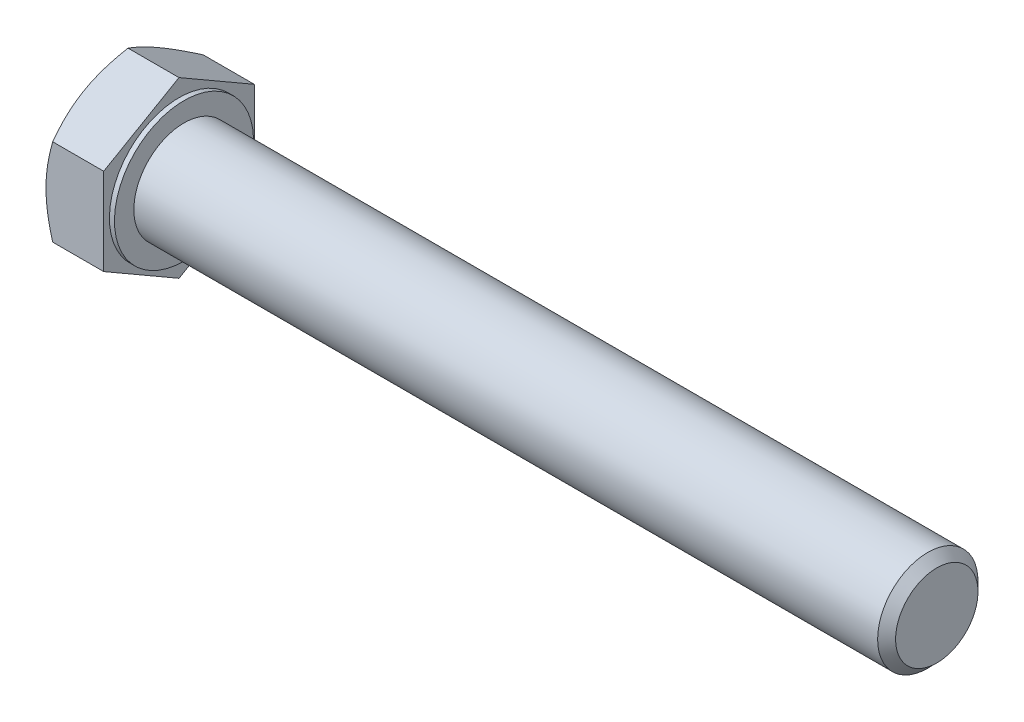
ISO-10303-21;
HEADER;
FILE_DESCRIPTION(('STEP AP214'),'2;1');
FILE_NAME('part.step','',(''),(''),'','','');
FILE_SCHEMA(('AUTOMOTIVE_DESIGN { 1 0 10303 214 1 1 1 1 }'));
ENDSEC;
DATA;
#1=APPLICATION_CONTEXT('core data for automotive mechanical design processes');
#2=APPLICATION_PROTOCOL_DEFINITION('international standard','automotive_design',2000,#1);
#3=PRODUCT_CONTEXT('',#1,'mechanical');
#4=PRODUCT('Part','Part','',(#3));
#5=PRODUCT_RELATED_PRODUCT_CATEGORY('part','',(#4));
#6=PRODUCT_DEFINITION_FORMATION('','',#4);
#7=PRODUCT_DEFINITION_CONTEXT('part definition',#1,'design');
#8=PRODUCT_DEFINITION('design','',#6,#7);
#9=PRODUCT_DEFINITION_SHAPE('','',#8);
#10=(LENGTH_UNIT() NAMED_UNIT(*) SI_UNIT(.MILLI.,.METRE.));
#11=(NAMED_UNIT(*) PLANE_ANGLE_UNIT() SI_UNIT($,.RADIAN.));
#12=(NAMED_UNIT(*) SI_UNIT($,.STERADIAN.) SOLID_ANGLE_UNIT());
#13=UNCERTAINTY_MEASURE_WITH_UNIT(LENGTH_MEASURE(1.E-05),#10,'distance_accuracy_value','');
#14=(GEOMETRIC_REPRESENTATION_CONTEXT(3) GLOBAL_UNCERTAINTY_ASSIGNED_CONTEXT((#13)) GLOBAL_UNIT_ASSIGNED_CONTEXT((#10,
#11,#12)) REPRESENTATION_CONTEXT('',''));
#15=CARTESIAN_POINT('',(0.,0.,0.));
#16=DIRECTION('',(0.,0.,1.));
#17=DIRECTION('',(1.,0.,0.));
#18=AXIS2_PLACEMENT_3D('',#15,#16,#17);
#19=CARTESIAN_POINT('',(0.,7.1575,0.));
#20=DIRECTION('',(1.,0.,0.));
#21=DIRECTION('',(0.,1.,0.));
#22=AXIS2_PLACEMENT_3D('',#19,#20,#21);
#23=PLANE('',#22);
#24=CARTESIAN_POINT('',(0.,0.,0.));
#25=DIRECTION('',(1.,0.,0.));
#26=DIRECTION('',(0.,1.,0.));
#27=AXIS2_PLACEMENT_3D('',#24,#25,#26);
#28=CIRCLE('',#27,6.);
#29=CARTESIAN_POINT('',(0.,-6.,0.));
#30=VERTEX_POINT('',#29);
#31=EDGE_CURVE('E245',#30,#30,#28,.T.);
#32=ORIENTED_EDGE('',*,*,#31,.F.);
#33=EDGE_LOOP('',(#32));
#34=FACE_BOUND('',#33,.T.);
#35=CARTESIAN_POINT('',(0.,0.,0.));
#36=DIRECTION('',(1.,0.,0.));
#37=DIRECTION('',(0.,1.,0.));
#38=AXIS2_PLACEMENT_3D('',#35,#36,#37);
#39=CIRCLE('',#38,8.315);
#40=CARTESIAN_POINT('',(0.,-8.315,0.));
#41=VERTEX_POINT('',#40);
#42=EDGE_CURVE('E28',#41,#41,#39,.T.);
#43=ORIENTED_EDGE('',*,*,#42,.T.);
#44=EDGE_LOOP('',(#43));
#45=FACE_BOUND('',#44,.T.);
#46=ADVANCED_FACE('F17',(#34,#45),#23,.T.);
#47=CARTESIAN_POINT('',(-0.300049999999992,0.,0.));
#48=DIRECTION('',(1.,0.,0.));
#49=DIRECTION('',(0.,1.,0.));
#50=AXIS2_PLACEMENT_3D('',#47,#48,#49);
#51=CYLINDRICAL_SURFACE('',#50,8.315);
#52=ORIENTED_EDGE('',*,*,#42,.F.);
#53=DIRECTION('',(-1.,0.,0.));
#54=VECTOR('',#53,1.);
#55=CARTESIAN_POINT('',(-0.300049999999992,-8.315,0.));
#56=LINE('',#55,#54);
#57=CARTESIAN_POINT('',(-0.6001,-8.315,0.));
#58=VERTEX_POINT('',#57);
#59=EDGE_CURVE('E11',#41,#58,#56,.T.);
#60=ORIENTED_EDGE('',*,*,#59,.T.);
#61=CARTESIAN_POINT('',(-0.6001,0.,0.));
#62=DIRECTION('',(1.,0.,0.));
#63=DIRECTION('',(0.,1.,0.));
#64=AXIS2_PLACEMENT_3D('',#61,#62,#63);
#65=CIRCLE('',#64,8.315);
#66=EDGE_CURVE('E205',#58,#58,#65,.T.);
#67=ORIENTED_EDGE('',*,*,#66,.T.);
#68=ORIENTED_EDGE('',*,*,#59,.F.);
#69=EDGE_LOOP('',(#52,#60,#67,#68));
#70=FACE_BOUND('',#69,.T.);
#71=ADVANCED_FACE('F375',(#70),#51,.T.);
#72=CARTESIAN_POINT('',(-7.5001,0.,0.));
#73=DIRECTION('',(1.,0.,0.));
#74=DIRECTION('',(0.,1.,0.));
#75=AXIS2_PLACEMENT_3D('',#72,#73,#74);
#76=PLANE('',#75);
#77=CARTESIAN_POINT('',(-7.5001,0.,0.));
#78=DIRECTION('',(-1.,0.,0.));
#79=DIRECTION('',(0.,1.,0.));
#80=AXIS2_PLACEMENT_3D('',#77,#78,#79);
#81=CIRCLE('',#80,9.);
#82=CARTESIAN_POINT('',(-7.5001,0.,9.));
#83=VERTEX_POINT('',#82);
#84=CARTESIAN_POINT('',(-7.5001,7.79422863405994,4.5));
#85=VERTEX_POINT('',#84);
#86=EDGE_CURVE('E234',#83,#85,#81,.T.);
#87=ORIENTED_EDGE('',*,*,#86,.T.);
#88=CARTESIAN_POINT('',(-7.5001,0.,0.));
#89=DIRECTION('',(-1.,0.,0.));
#90=DIRECTION('',(0.,1.,0.));
#91=AXIS2_PLACEMENT_3D('',#88,#89,#90);
#92=CIRCLE('',#91,9.);
#93=CARTESIAN_POINT('',(-7.5001,7.79422863405994,-4.5));
#94=VERTEX_POINT('',#93);
#95=EDGE_CURVE('E166',#85,#94,#92,.T.);
#96=ORIENTED_EDGE('',*,*,#95,.T.);
#97=CARTESIAN_POINT('',(-7.5001,0.,0.));
#98=DIRECTION('',(-1.,0.,0.));
#99=DIRECTION('',(0.,1.,0.));
#100=AXIS2_PLACEMENT_3D('',#97,#98,#99);
#101=CIRCLE('',#100,9.);
#102=CARTESIAN_POINT('',(-7.5001,0.,-9.));
#103=VERTEX_POINT('',#102);
#104=EDGE_CURVE('E189',#94,#103,#101,.T.);
#105=ORIENTED_EDGE('',*,*,#104,.T.);
#106=CARTESIAN_POINT('',(-7.5001,0.,0.));
#107=DIRECTION('',(-1.,0.,0.));
#108=DIRECTION('',(0.,1.,0.));
#109=AXIS2_PLACEMENT_3D('',#106,#107,#108);
#110=CIRCLE('',#109,9.);
#111=CARTESIAN_POINT('',(-7.5001,-7.79422863405994,-4.5));
#112=VERTEX_POINT('',#111);
#113=EDGE_CURVE('E21',#103,#112,#110,.T.);
#114=ORIENTED_EDGE('',*,*,#113,.T.);
#115=CARTESIAN_POINT('',(-7.5001,0.,0.));
#116=DIRECTION('',(-1.,0.,0.));
#117=DIRECTION('',(0.,1.,0.));
#118=AXIS2_PLACEMENT_3D('',#115,#116,#117);
#119=CIRCLE('',#118,9.);
#120=CARTESIAN_POINT('',(-7.5001,-7.79422863405995,4.5));
#121=VERTEX_POINT('',#120);
#122=EDGE_CURVE('E156',#112,#121,#119,.T.);
#123=ORIENTED_EDGE('',*,*,#122,.T.);
#124=CARTESIAN_POINT('',(-7.5001,0.,0.));
#125=DIRECTION('',(-1.,0.,0.));
#126=DIRECTION('',(0.,1.,0.));
#127=AXIS2_PLACEMENT_3D('',#124,#125,#126);
#128=CIRCLE('',#127,9.);
#129=EDGE_CURVE('E214',#121,#83,#128,.T.);
#130=ORIENTED_EDGE('',*,*,#129,.T.);
#131=EDGE_LOOP('',(#87,#96,#105,#114,#123,#130));
#132=FACE_BOUND('',#131,.T.);
#133=ADVANCED_FACE('F338',(#132),#76,.F.);
#134=CARTESIAN_POINT('',(-0.600099999999993,-10.3923048454133,0.));
#135=DIRECTION('',(0.,-0.866025403784438,-0.5));
#136=DIRECTION('',(0.,0.5,-0.866025403784438));
#137=AXIS2_PLACEMENT_3D('',#134,#135,#136);
#138=PLANE('',#137);
#139=CARTESIAN_POINT('',(-7.5001,-7.79422863405994,-4.5));
#140=CARTESIAN_POINT('',(-7.50010000000001,-6.58845726811989,-6.58845726811988));
#141=CARTESIAN_POINT('',(-6.69625242270666,-5.19615242270663,-9.));
#142=(BOUNDED_CURVE() B_SPLINE_CURVE(2,(#139,#140,#141),.UNSPECIFIED.,.F.,
.F.) B_SPLINE_CURVE_WITH_KNOTS((3,3),(0.527138746897715,1.05427749379543),
.UNSPECIFIED.) CURVE() GEOMETRIC_REPRESENTATION_ITEM() RATIONAL_B_SPLINE_CURVE((1.,
1.03795484930204,1.)) REPRESENTATION_ITEM(''));
#143=CARTESIAN_POINT('',(-6.69625242270666,-5.19615242270664,-9.));
#144=VERTEX_POINT('',#143);
#145=EDGE_CURVE('E233',#112,#144,#142,.T.);
#146=ORIENTED_EDGE('',*,*,#145,.T.);
#147=DIRECTION('',(-1.,0.,0.));
#148=VECTOR('',#147,1.);
#149=CARTESIAN_POINT('',(-0.6001,-5.19615242270662,-9.));
#150=LINE('',#149,#148);
#151=CARTESIAN_POINT('',(-0.6001,-5.19615242270662,-9.));
#152=VERTEX_POINT('',#151);
#153=EDGE_CURVE('E250',#152,#144,#150,.T.);
#154=ORIENTED_EDGE('',*,*,#153,.F.);
#155=DIRECTION('',(0.,0.5,-0.866025403784438));
#156=VECTOR('',#155,1.);
#157=CARTESIAN_POINT('',(-0.600099999999993,-10.3923048454133,0.));
#158=LINE('',#157,#156);
#159=CARTESIAN_POINT('',(-0.600099999999993,-10.3923048454133,0.));
#160=VERTEX_POINT('',#159);
#161=EDGE_CURVE('E139',#160,#152,#158,.T.);
#162=ORIENTED_EDGE('',*,*,#161,.F.);
#163=DIRECTION('',(-1.,0.,0.));
#164=VECTOR('',#163,1.);
#165=CARTESIAN_POINT('',(-0.600099999999993,-10.3923048454133,0.));
#166=LINE('',#165,#164);
#167=CARTESIAN_POINT('',(-6.69625242270666,-10.3923048454132,0.));
#168=VERTEX_POINT('',#167);
#169=EDGE_CURVE('E132',#160,#168,#166,.T.);
#170=ORIENTED_EDGE('',*,*,#169,.T.);
#171=CARTESIAN_POINT('',(-6.69625242270666,-10.3923048454132,0.));
#172=CARTESIAN_POINT('',(-7.50010000000001,-8.99999999999998,-2.41154273188012));
#173=CARTESIAN_POINT('',(-7.5001,-7.79422863405994,-4.5));
#174=(BOUNDED_CURVE() B_SPLINE_CURVE(2,(#171,#172,#173),.UNSPECIFIED.,.F.,
.F.) B_SPLINE_CURVE_WITH_KNOTS((3,3),(0.,0.527138746897715),
.UNSPECIFIED.) CURVE() GEOMETRIC_REPRESENTATION_ITEM() RATIONAL_B_SPLINE_CURVE((1.,
1.03795484930204,1.)) REPRESENTATION_ITEM(''));
#175=EDGE_CURVE('E137',#168,#112,#174,.T.);
#176=ORIENTED_EDGE('',*,*,#175,.T.);
#177=EDGE_LOOP('',(#146,#154,#162,#170,#176));
#178=FACE_BOUND('',#177,.T.);
#179=ADVANCED_FACE('F135',(#178),#138,.T.);
#180=CARTESIAN_POINT('',(-0.6001,-5.19615242270663,9.));
#181=DIRECTION('',(0.,-0.866025403784439,0.5));
#182=DIRECTION('',(-1.,0.,0.));
#183=AXIS2_PLACEMENT_3D('',#180,#181,#182);
#184=PLANE('',#183);
#185=CARTESIAN_POINT('',(-7.5001,-7.79422863405995,4.5));
#186=CARTESIAN_POINT('',(-7.50010000000002,-8.99999999999999,2.4115427318801));
#187=CARTESIAN_POINT('',(-6.69625242270666,-10.3923048454132,0.));
#188=(BOUNDED_CURVE() B_SPLINE_CURVE(2,(#185,#186,#187),.UNSPECIFIED.,.F.,
.F.) B_SPLINE_CURVE_WITH_KNOTS((3,3),(0.527138746897716,1.05427749379543),
.UNSPECIFIED.) CURVE() GEOMETRIC_REPRESENTATION_ITEM() RATIONAL_B_SPLINE_CURVE((1.,
1.03795484930203,1.)) REPRESENTATION_ITEM(''));
#189=EDGE_CURVE('E148',#121,#168,#188,.T.);
#190=ORIENTED_EDGE('',*,*,#189,.T.);
#191=ORIENTED_EDGE('',*,*,#169,.F.);
#192=DIRECTION('',(0.,-0.5,-0.866025403784439));
#193=VECTOR('',#192,1.);
#194=CARTESIAN_POINT('',(-0.6001,-5.19615242270663,9.));
#195=LINE('',#194,#193);
#196=CARTESIAN_POINT('',(-0.6001,-5.19615242270663,9.));
#197=VERTEX_POINT('',#196);
#198=EDGE_CURVE('E215',#197,#160,#195,.T.);
#199=ORIENTED_EDGE('',*,*,#198,.F.);
#200=DIRECTION('',(-1.,0.,0.));
#201=VECTOR('',#200,1.);
#202=CARTESIAN_POINT('',(-0.6001,-5.19615242270663,9.));
#203=LINE('',#202,#201);
#204=CARTESIAN_POINT('',(-6.69625242270666,-5.1961524227066,9.));
#205=VERTEX_POINT('',#204);
#206=EDGE_CURVE('E144',#197,#205,#203,.T.);
#207=ORIENTED_EDGE('',*,*,#206,.T.);
#208=CARTESIAN_POINT('',(-6.69625242270666,-5.19615242270665,9.));
#209=CARTESIAN_POINT('',(-7.50010000000001,-6.5884572681199,6.58845726811988));
#210=CARTESIAN_POINT('',(-7.5001,-7.79422863405995,4.5));
#211=(BOUNDED_CURVE() B_SPLINE_CURVE(2,(#208,#209,#210),.UNSPECIFIED.,.F.,
.F.) B_SPLINE_CURVE_WITH_KNOTS((3,3),(0.,0.527138746897716),
.UNSPECIFIED.) CURVE() GEOMETRIC_REPRESENTATION_ITEM() RATIONAL_B_SPLINE_CURVE((1.,
1.03795484930204,1.)) REPRESENTATION_ITEM(''));
#212=EDGE_CURVE('E151',#205,#121,#211,.T.);
#213=ORIENTED_EDGE('',*,*,#212,.T.);
#214=EDGE_LOOP('',(#190,#191,#199,#207,#213));
#215=FACE_BOUND('',#214,.T.);
#216=ADVANCED_FACE('F149',(#215),#184,.T.);
#217=CARTESIAN_POINT('',(-0.6001,5.19615242270662,9.));
#218=DIRECTION('',(0.,0.,1.));
#219=DIRECTION('',(0.,-1.,0.));
#220=AXIS2_PLACEMENT_3D('',#217,#218,#219);
#221=PLANE('',#220);
#222=CARTESIAN_POINT('',(-7.5001,0.,9.));
#223=CARTESIAN_POINT('',(-7.50010000000003,-2.41154273188009,8.99999999999999));
#224=CARTESIAN_POINT('',(-6.69625242270665,-5.19615242270661,9.));
#225=(BOUNDED_CURVE() B_SPLINE_CURVE(2,(#222,#223,#224),.UNSPECIFIED.,.F.,
.F.) B_SPLINE_CURVE_WITH_KNOTS((3,3),(0.527138746897716,1.05427749379543),
.UNSPECIFIED.) CURVE() GEOMETRIC_REPRESENTATION_ITEM() RATIONAL_B_SPLINE_CURVE((1.,
1.03795484930205,1.)) REPRESENTATION_ITEM(''));
#226=EDGE_CURVE('E172',#83,#205,#225,.T.);
#227=ORIENTED_EDGE('',*,*,#226,.T.);
#228=ORIENTED_EDGE('',*,*,#206,.F.);
#229=DIRECTION('',(0.,-1.,0.));
#230=VECTOR('',#229,1.);
#231=CARTESIAN_POINT('',(-0.6001,5.19615242270662,9.));
#232=LINE('',#231,#230);
#233=CARTESIAN_POINT('',(-0.6001,5.19615242270662,9.));
#234=VERTEX_POINT('',#233);
#235=EDGE_CURVE('E221',#234,#197,#232,.T.);
#236=ORIENTED_EDGE('',*,*,#235,.F.);
#237=DIRECTION('',(-1.,0.,0.));
#238=VECTOR('',#237,1.);
#239=CARTESIAN_POINT('',(-0.6001,5.19615242270662,9.));
#240=LINE('',#239,#238);
#241=CARTESIAN_POINT('',(-6.69625242270666,5.19615242270659,9.));
#242=VERTEX_POINT('',#241);
#243=EDGE_CURVE('E272',#234,#242,#240,.T.);
#244=ORIENTED_EDGE('',*,*,#243,.T.);
#245=CARTESIAN_POINT('',(-6.69625242270666,5.1961524227066,9.));
#246=CARTESIAN_POINT('',(-7.50010000000001,2.41154273188008,8.99999999999999));
#247=CARTESIAN_POINT('',(-7.5001,0.,9.));
#248=(BOUNDED_CURVE() B_SPLINE_CURVE(2,(#245,#246,#247),.UNSPECIFIED.,.F.,
.F.) B_SPLINE_CURVE_WITH_KNOTS((3,3),(0.,0.527138746897716),
.UNSPECIFIED.) CURVE() GEOMETRIC_REPRESENTATION_ITEM() RATIONAL_B_SPLINE_CURVE((1.,
1.03795484930204,1.)) REPRESENTATION_ITEM(''));
#249=EDGE_CURVE('E197',#242,#83,#248,.T.);
#250=ORIENTED_EDGE('',*,*,#249,.T.);
#251=EDGE_LOOP('',(#227,#228,#236,#244,#250));
#252=FACE_BOUND('',#251,.T.);
#253=ADVANCED_FACE('F402',(#252),#221,.T.);
#254=CARTESIAN_POINT('',(-0.6001,0.,0.));
#255=DIRECTION('',(1.,0.,0.));
#256=DIRECTION('',(0.,1.,0.));
#257=AXIS2_PLACEMENT_3D('',#254,#255,#256);
#258=PLANE('',#257);
#259=ORIENTED_EDGE('',*,*,#66,.F.);
#260=EDGE_LOOP('',(#259));
#261=FACE_BOUND('',#260,.T.);
#262=DIRECTION('',(0.,-0.5,0.866025403784438));
#263=VECTOR('',#262,1.);
#264=CARTESIAN_POINT('',(-0.6001,10.3923048454133,0.));
#265=LINE('',#264,#263);
#266=CARTESIAN_POINT('',(-0.6001,10.3923048454133,0.));
#267=VERTEX_POINT('',#266);
#268=EDGE_CURVE('E268',#267,#234,#265,.T.);
#269=ORIENTED_EDGE('',*,*,#268,.T.);
#270=ORIENTED_EDGE('',*,*,#235,.T.);
#271=ORIENTED_EDGE('',*,*,#198,.T.);
#272=ORIENTED_EDGE('',*,*,#161,.T.);
#273=DIRECTION('',(0.,1.,0.));
#274=VECTOR('',#273,1.);
#275=CARTESIAN_POINT('',(-0.6001,-5.19615242270662,-9.));
#276=LINE('',#275,#274);
#277=CARTESIAN_POINT('',(-0.6001,5.19615242270663,-9.));
#278=VERTEX_POINT('',#277);
#279=EDGE_CURVE('E246',#152,#278,#276,.T.);
#280=ORIENTED_EDGE('',*,*,#279,.T.);
#281=DIRECTION('',(0.,0.5,0.866025403784439));
#282=VECTOR('',#281,1.);
#283=CARTESIAN_POINT('',(-0.6001,5.19615242270663,-9.));
#284=LINE('',#283,#282);
#285=EDGE_CURVE('E267',#278,#267,#284,.T.);
#286=ORIENTED_EDGE('',*,*,#285,.T.);
#287=EDGE_LOOP('',(#269,#270,#271,#272,#280,#286));
#288=FACE_BOUND('',#287,.T.);
#289=ADVANCED_FACE('F388',(#261,#288),#258,.T.);
#290=CARTESIAN_POINT('',(-0.6001,10.3923048454133,0.));
#291=DIRECTION('',(0.,0.866025403784438,0.5));
#292=DIRECTION('',(1.,0.,0.));
#293=AXIS2_PLACEMENT_3D('',#290,#291,#292);
#294=PLANE('',#293);
#295=CARTESIAN_POINT('',(-6.69625242270666,10.3923048454132,0.));
#296=CARTESIAN_POINT('',(-7.50010000000002,8.99999999999999,2.41154273188012));
#297=CARTESIAN_POINT('',(-7.5001,7.79422863405994,4.5));
#298=(BOUNDED_CURVE() B_SPLINE_CURVE(2,(#295,#296,#297),.UNSPECIFIED.,.F.,
.F.) B_SPLINE_CURVE_WITH_KNOTS((3,3),(0.,0.527138746897715),
.UNSPECIFIED.) CURVE() GEOMETRIC_REPRESENTATION_ITEM() RATIONAL_B_SPLINE_CURVE((1.,
1.03795484930205,1.)) REPRESENTATION_ITEM(''));
#299=CARTESIAN_POINT('',(-6.69625242270666,10.3923048454132,0.));
#300=VERTEX_POINT('',#299);
#301=EDGE_CURVE('E160',#300,#85,#298,.T.);
#302=ORIENTED_EDGE('',*,*,#301,.T.);
#303=CARTESIAN_POINT('',(-7.5001,7.79422863405994,4.5));
#304=CARTESIAN_POINT('',(-7.50010000000001,6.58845726811989,6.58845726811989));
#305=CARTESIAN_POINT('',(-6.69625242270666,5.19615242270664,9.));
#306=(BOUNDED_CURVE() B_SPLINE_CURVE(2,(#303,#304,#305),.UNSPECIFIED.,.F.,
.F.) B_SPLINE_CURVE_WITH_KNOTS((3,3),(0.527138746897715,1.05427749379543),
.UNSPECIFIED.) CURVE() GEOMETRIC_REPRESENTATION_ITEM() RATIONAL_B_SPLINE_CURVE((1.,
1.03795484930204,1.)) REPRESENTATION_ITEM(''));
#307=EDGE_CURVE('E241',#85,#242,#306,.T.);
#308=ORIENTED_EDGE('',*,*,#307,.T.);
#309=ORIENTED_EDGE('',*,*,#243,.F.);
#310=ORIENTED_EDGE('',*,*,#268,.F.);
#311=DIRECTION('',(-1.,0.,0.));
#312=VECTOR('',#311,1.);
#313=CARTESIAN_POINT('',(-0.6001,10.3923048454133,0.));
#314=LINE('',#313,#312);
#315=EDGE_CURVE('E264',#267,#300,#314,.T.);
#316=ORIENTED_EDGE('',*,*,#315,.T.);
#317=EDGE_LOOP('',(#302,#308,#309,#310,#316));
#318=FACE_BOUND('',#317,.T.);
#319=ADVANCED_FACE('F386',(#318),#294,.T.);
#320=CARTESIAN_POINT('',(-0.6001,5.19615242270663,-9.));
#321=DIRECTION('',(0.,0.866025403784439,-0.5));
#322=DIRECTION('',(-1.,0.,0.));
#323=AXIS2_PLACEMENT_3D('',#320,#321,#322);
#324=PLANE('',#323);
#325=CARTESIAN_POINT('',(-6.69625242270666,5.19615242270664,-9.));
#326=CARTESIAN_POINT('',(-7.50010000000001,6.5884572681199,-6.58845726811988));
#327=CARTESIAN_POINT('',(-7.5001,7.79422863405994,-4.5));
#328=(BOUNDED_CURVE() B_SPLINE_CURVE(2,(#325,#326,#327),.UNSPECIFIED.,.F.,
.F.) B_SPLINE_CURVE_WITH_KNOTS((3,3),(0.,0.527138746897716),
.UNSPECIFIED.) CURVE() GEOMETRIC_REPRESENTATION_ITEM() RATIONAL_B_SPLINE_CURVE((1.,
1.03795484930204,1.)) REPRESENTATION_ITEM(''));
#329=CARTESIAN_POINT('',(-6.69625242270666,5.1961524227066,-9.));
#330=VERTEX_POINT('',#329);
#331=EDGE_CURVE('E204',#330,#94,#328,.T.);
#332=ORIENTED_EDGE('',*,*,#331,.T.);
#333=CARTESIAN_POINT('',(-7.5001,7.79422863405994,-4.5));
#334=CARTESIAN_POINT('',(-7.50010000000002,8.99999999999999,-2.41154273188011));
#335=CARTESIAN_POINT('',(-6.69625242270666,10.3923048454132,0.));
#336=(BOUNDED_CURVE() B_SPLINE_CURVE(2,(#333,#334,#335),.UNSPECIFIED.,.F.,
.F.) B_SPLINE_CURVE_WITH_KNOTS((3,3),(0.527138746897716,1.05427749379543),
.UNSPECIFIED.) CURVE() GEOMETRIC_REPRESENTATION_ITEM() RATIONAL_B_SPLINE_CURVE((1.,
1.03795484930204,1.)) REPRESENTATION_ITEM(''));
#337=EDGE_CURVE('E208',#94,#300,#336,.T.);
#338=ORIENTED_EDGE('',*,*,#337,.T.);
#339=ORIENTED_EDGE('',*,*,#315,.F.);
#340=ORIENTED_EDGE('',*,*,#285,.F.);
#341=DIRECTION('',(-1.,0.,0.));
#342=VECTOR('',#341,1.);
#343=CARTESIAN_POINT('',(-0.6001,5.19615242270663,-9.));
#344=LINE('',#343,#342);
#345=EDGE_CURVE('E251',#278,#330,#344,.T.);
#346=ORIENTED_EDGE('',*,*,#345,.T.);
#347=EDGE_LOOP('',(#332,#338,#339,#340,#346));
#348=FACE_BOUND('',#347,.T.);
#349=ADVANCED_FACE('F19',(#348),#324,.T.);
#350=CARTESIAN_POINT('',(-0.6001,-5.19615242270662,-9.));
#351=DIRECTION('',(0.,0.,-1.));
#352=DIRECTION('',(-1.,0.,0.));
#353=AXIS2_PLACEMENT_3D('',#350,#351,#352);
#354=PLANE('',#353);
#355=CARTESIAN_POINT('',(-6.69625242270666,-5.1961524227066,-9.));
#356=CARTESIAN_POINT('',(-7.50010000000002,-2.41154273188008,-8.99999999999999));
#357=CARTESIAN_POINT('',(-7.5001,0.,-9.));
#358=(BOUNDED_CURVE() B_SPLINE_CURVE(2,(#355,#356,#357),.UNSPECIFIED.,.F.,
.F.) B_SPLINE_CURVE_WITH_KNOTS((3,3),(0.,0.527138746897715),
.UNSPECIFIED.) CURVE() GEOMETRIC_REPRESENTATION_ITEM() RATIONAL_B_SPLINE_CURVE((1.,
1.03795484930202,1.)) REPRESENTATION_ITEM(''));
#359=EDGE_CURVE('E227',#144,#103,#358,.T.);
#360=ORIENTED_EDGE('',*,*,#359,.T.);
#361=CARTESIAN_POINT('',(-7.5001,0.,-9.));
#362=CARTESIAN_POINT('',(-7.50010000000002,2.41154273188008,-8.99999999999999));
#363=CARTESIAN_POINT('',(-6.69625242270666,5.1961524227066,-9.));
#364=(BOUNDED_CURVE() B_SPLINE_CURVE(2,(#361,#362,#363),.UNSPECIFIED.,.F.,
.F.) B_SPLINE_CURVE_WITH_KNOTS((3,3),(0.527138746897715,1.05427749379543),
.UNSPECIFIED.) CURVE() GEOMETRIC_REPRESENTATION_ITEM() RATIONAL_B_SPLINE_CURVE((1.,
1.03795484930203,1.)) REPRESENTATION_ITEM(''));
#365=EDGE_CURVE('E183',#103,#330,#364,.T.);
#366=ORIENTED_EDGE('',*,*,#365,.T.);
#367=ORIENTED_EDGE('',*,*,#345,.F.);
#368=ORIENTED_EDGE('',*,*,#279,.F.);
#369=ORIENTED_EDGE('',*,*,#153,.T.);
#370=EDGE_LOOP('',(#360,#366,#367,#368,#369));
#371=FACE_BOUND('',#370,.T.);
#372=ADVANCED_FACE('F344',(#371),#354,.T.);
#373=CARTESIAN_POINT('',(-7.09817621135333,0.,0.));
#374=DIRECTION('',(1.,0.,0.));
#375=DIRECTION('',(0.,1.,0.));
#376=AXIS2_PLACEMENT_3D('',#373,#374,#375);
#377=CONICAL_SURFACE('',#376,9.69615242270662,1.0471975511966);
#378=ORIENTED_EDGE('',*,*,#359,.F.);
#379=ORIENTED_EDGE('',*,*,#145,.F.);
#380=ORIENTED_EDGE('',*,*,#113,.F.);
#381=EDGE_LOOP('',(#378,#379,#380));
#382=FACE_BOUND('',#381,.T.);
#383=ADVANCED_FACE('F342',(#382),#377,.T.);
#384=CARTESIAN_POINT('',(-7.09817621135333,0.,0.));
#385=DIRECTION('',(1.,0.,0.));
#386=DIRECTION('',(0.,1.,0.));
#387=AXIS2_PLACEMENT_3D('',#384,#385,#386);
#388=CONICAL_SURFACE('',#387,9.69615242270662,1.0471975511966);
#389=ORIENTED_EDGE('',*,*,#365,.F.);
#390=ORIENTED_EDGE('',*,*,#104,.F.);
#391=ORIENTED_EDGE('',*,*,#331,.F.);
#392=EDGE_LOOP('',(#389,#390,#391));
#393=FACE_BOUND('',#392,.T.);
#394=ADVANCED_FACE('F420',(#393),#388,.T.);
#395=CARTESIAN_POINT('',(-7.09817621135333,0.,0.));
#396=DIRECTION('',(1.,0.,0.));
#397=DIRECTION('',(0.,-1.,0.));
#398=AXIS2_PLACEMENT_3D('',#395,#396,#397);
#399=CONICAL_SURFACE('',#398,9.69615242270662,1.0471975511966);
#400=ORIENTED_EDGE('',*,*,#175,.F.);
#401=ORIENTED_EDGE('',*,*,#189,.F.);
#402=ORIENTED_EDGE('',*,*,#122,.F.);
#403=EDGE_LOOP('',(#400,#401,#402));
#404=FACE_BOUND('',#403,.T.);
#405=ADVANCED_FACE('F158',(#404),#399,.T.);
#406=CARTESIAN_POINT('',(-7.09817621135333,0.,0.));
#407=DIRECTION('',(1.,0.,0.));
#408=DIRECTION('',(0.,1.,0.));
#409=AXIS2_PLACEMENT_3D('',#406,#407,#408);
#410=CONICAL_SURFACE('',#409,9.69615242270662,1.0471975511966);
#411=ORIENTED_EDGE('',*,*,#337,.F.);
#412=ORIENTED_EDGE('',*,*,#95,.F.);
#413=ORIENTED_EDGE('',*,*,#301,.F.);
#414=EDGE_LOOP('',(#411,#412,#413));
#415=FACE_BOUND('',#414,.T.);
#416=ADVANCED_FACE('F395',(#415),#410,.T.);
#417=CARTESIAN_POINT('',(-7.09817621135333,0.,0.));
#418=DIRECTION('',(1.,0.,0.));
#419=DIRECTION('',(0.,1.,0.));
#420=AXIS2_PLACEMENT_3D('',#417,#418,#419);
#421=CONICAL_SURFACE('',#420,9.69615242270662,1.0471975511966);
#422=ORIENTED_EDGE('',*,*,#212,.F.);
#423=ORIENTED_EDGE('',*,*,#226,.F.);
#424=ORIENTED_EDGE('',*,*,#129,.F.);
#425=EDGE_LOOP('',(#422,#423,#424));
#426=FACE_BOUND('',#425,.T.);
#427=ADVANCED_FACE('F390',(#426),#421,.T.);
#428=CARTESIAN_POINT('',(-7.09817621135333,0.,0.));
#429=DIRECTION('',(1.,0.,0.));
#430=DIRECTION('',(0.,1.,0.));
#431=AXIS2_PLACEMENT_3D('',#428,#429,#430);
#432=CONICAL_SURFACE('',#431,9.69615242270662,1.0471975511966);
#433=ORIENTED_EDGE('',*,*,#307,.F.);
#434=ORIENTED_EDGE('',*,*,#86,.F.);
#435=ORIENTED_EDGE('',*,*,#249,.F.);
#436=EDGE_LOOP('',(#433,#434,#435));
#437=FACE_BOUND('',#436,.T.);
#438=ADVANCED_FACE('F369',(#437),#432,.T.);
#439=CARTESIAN_POINT('',(90.,3.,0.));
#440=DIRECTION('',(1.,0.,0.));
#441=DIRECTION('',(0.,1.,0.));
#442=AXIS2_PLACEMENT_3D('',#439,#440,#441);
#443=PLANE('',#442);
#444=CARTESIAN_POINT('',(90.,0.,0.));
#445=DIRECTION('',(-1.,0.,0.));
#446=DIRECTION('',(0.,-1.,0.));
#447=AXIS2_PLACEMENT_3D('',#444,#445,#446);
#448=CIRCLE('',#447,4.92646250000001);
#449=CARTESIAN_POINT('',(90.,4.92646250000002,0.));
#450=VERTEX_POINT('',#449);
#451=EDGE_CURVE('E176',#450,#450,#448,.T.);
#452=ORIENTED_EDGE('',*,*,#451,.F.);
#453=EDGE_LOOP('',(#452));
#454=FACE_BOUND('',#453,.T.);
#455=ADVANCED_FACE('F362',(#454),#443,.T.);
#456=CARTESIAN_POINT('',(47.65,0.,0.));
#457=DIRECTION('',(1.,0.,0.));
#458=DIRECTION('',(0.,1.,0.));
#459=AXIS2_PLACEMENT_3D('',#456,#457,#458);
#460=CYLINDRICAL_SURFACE('',#459,6.);
#461=CARTESIAN_POINT('',(88.9263625,0.,0.));
#462=DIRECTION('',(1.,0.,0.));
#463=DIRECTION('',(0.,-1.,0.));
#464=AXIS2_PLACEMENT_3D('',#461,#462,#463);
#465=CIRCLE('',#464,6.);
#466=CARTESIAN_POINT('',(88.9263625,6.,0.));
#467=VERTEX_POINT('',#466);
#468=CARTESIAN_POINT('',(88.9263625,-6.,0.));
#469=VERTEX_POINT('',#468);
#470=EDGE_CURVE('E226',#467,#469,#465,.T.);
#471=ORIENTED_EDGE('',*,*,#470,.F.);
#472=CARTESIAN_POINT('',(88.9263625,0.,0.));
#473=DIRECTION('',(1.,0.,0.));
#474=DIRECTION('',(0.,-1.,0.));
#475=AXIS2_PLACEMENT_3D('',#472,#473,#474);
#476=CIRCLE('',#475,6.);
#477=EDGE_CURVE('E222',#469,#467,#476,.T.);
#478=ORIENTED_EDGE('',*,*,#477,.F.);
#479=DIRECTION('',(-1.,0.,0.));
#480=VECTOR('',#479,1.);
#481=CARTESIAN_POINT('',(47.65,-6.,0.));
#482=LINE('',#481,#480);
#483=EDGE_CURVE('E225',#469,#30,#482,.T.);
#484=ORIENTED_EDGE('',*,*,#483,.T.);
#485=ORIENTED_EDGE('',*,*,#31,.T.);
#486=ORIENTED_EDGE('',*,*,#483,.F.);
#487=EDGE_LOOP('',(#471,#478,#484,#485,#486));
#488=FACE_BOUND('',#487,.T.);
#489=ADVANCED_FACE('F360',(#488),#460,.T.);
#490=CARTESIAN_POINT('',(89.46318125,0.,0.));
#491=DIRECTION('',(-1.,0.,0.));
#492=DIRECTION('',(0.,-1.,0.));
#493=AXIS2_PLACEMENT_3D('',#490,#491,#492);
#494=CONICAL_SURFACE('',#493,5.46323125000001,0.785351590575053);
#495=ORIENTED_EDGE('',*,*,#451,.T.);
#496=DIRECTION('',(-0.707139712378203,0.707073848461158,0.));
#497=VECTOR('',#496,1.);
#498=CARTESIAN_POINT('',(89.46318125,5.46323125000002,0.));
#499=LINE('',#498,#497);
#500=EDGE_CURVE('E182',#450,#467,#499,.T.);
#501=ORIENTED_EDGE('',*,*,#500,.T.);
#502=ORIENTED_EDGE('',*,*,#470,.T.);
#503=ORIENTED_EDGE('',*,*,#477,.T.);
#504=ORIENTED_EDGE('',*,*,#500,.F.);
#505=EDGE_LOOP('',(#495,#501,#502,#503,#504));
#506=FACE_BOUND('',#505,.T.);
#507=ADVANCED_FACE('F358',(#506),#494,.T.);
#508=CLOSED_SHELL('',(#46,#71,#133,#179,#216,#253,#289,#319,#349,#372,#383,#394,#405,#416,#427,
#438,#455,#489,#507));
#509=MANIFOLD_SOLID_BREP('B1',#508);
#510=ADVANCED_BREP_SHAPE_REPRESENTATION('',(#18,#509),#14);
#511=SHAPE_DEFINITION_REPRESENTATION(#9,#510);
ENDSEC;
END-ISO-10303-21;
